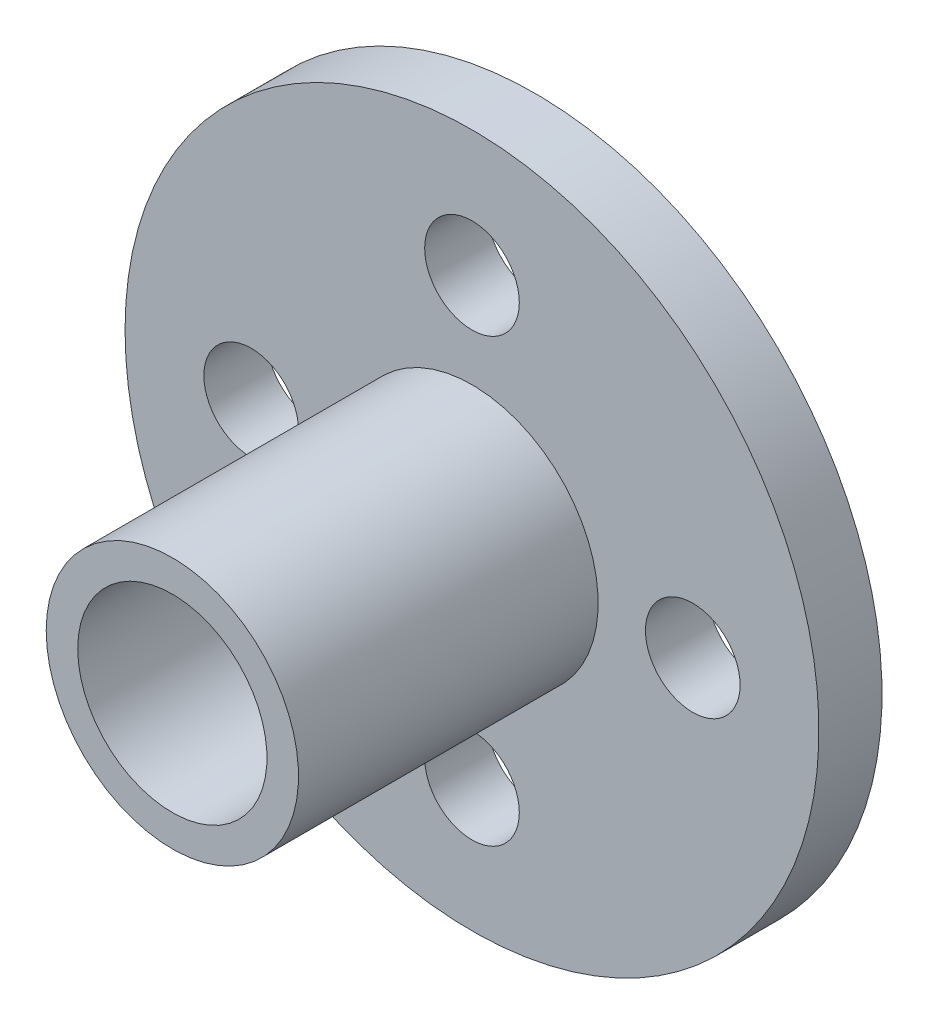
ISO-10303-21;
HEADER;
FILE_DESCRIPTION(('STEP AP214'),'2;1');
FILE_NAME('part.step','',(''),(''),'','','');
FILE_SCHEMA(('AUTOMOTIVE_DESIGN { 1 0 10303 214 1 1 1 1 }'));
ENDSEC;
DATA;
#1=APPLICATION_CONTEXT('core data for automotive mechanical design processes');
#2=APPLICATION_PROTOCOL_DEFINITION('international standard','automotive_design',2000,#1);
#3=PRODUCT_CONTEXT('',#1,'mechanical');
#4=PRODUCT('Part','Part','',(#3));
#5=PRODUCT_RELATED_PRODUCT_CATEGORY('part','',(#4));
#6=PRODUCT_DEFINITION_FORMATION('','',#4);
#7=PRODUCT_DEFINITION_CONTEXT('part definition',#1,'design');
#8=PRODUCT_DEFINITION('design','',#6,#7);
#9=PRODUCT_DEFINITION_SHAPE('','',#8);
#10=(LENGTH_UNIT() NAMED_UNIT(*) SI_UNIT(.MILLI.,.METRE.));
#11=(NAMED_UNIT(*) PLANE_ANGLE_UNIT() SI_UNIT($,.RADIAN.));
#12=(NAMED_UNIT(*) SI_UNIT($,.STERADIAN.) SOLID_ANGLE_UNIT());
#13=UNCERTAINTY_MEASURE_WITH_UNIT(LENGTH_MEASURE(1.E-05),#10,'distance_accuracy_value','');
#14=(GEOMETRIC_REPRESENTATION_CONTEXT(3) GLOBAL_UNCERTAINTY_ASSIGNED_CONTEXT((#13)) GLOBAL_UNIT_ASSIGNED_CONTEXT((#10,
#11,#12)) REPRESENTATION_CONTEXT('',''));
#15=CARTESIAN_POINT('',(0.,0.,0.));
#16=DIRECTION('',(0.,0.,1.));
#17=DIRECTION('',(1.,0.,0.));
#18=AXIS2_PLACEMENT_3D('',#15,#16,#17);
#19=CARTESIAN_POINT('',(2.99999999999999,0.,-3.3557561558247));
#20=DIRECTION('',(0.,0.,-1.));
#21=DIRECTION('',(-1.,0.,0.));
#22=AXIS2_PLACEMENT_3D('',#19,#20,#21);
#23=CYLINDRICAL_SURFACE('',#22,3.);
#24=CARTESIAN_POINT('',(3.,0.,0.));
#25=DIRECTION('',(0.,0.,-1.));
#26=DIRECTION('',(-1.,0.,0.));
#27=AXIS2_PLACEMENT_3D('',#24,#25,#26);
#28=CIRCLE('',#27,3.);
#29=CARTESIAN_POINT('',(0.,0.,0.));
#30=VERTEX_POINT('',#29);
#31=EDGE_CURVE('E10',#30,#30,#28,.T.);
#32=ORIENTED_EDGE('',*,*,#31,.T.);
#33=EDGE_LOOP('',(#32));
#34=FACE_BOUND('',#33,.T.);
#35=CARTESIAN_POINT('',(3.,0.,11.5));
#36=DIRECTION('',(0.,0.,-1.));
#37=DIRECTION('',(-1.,0.,0.));
#38=AXIS2_PLACEMENT_3D('',#35,#36,#37);
#39=CIRCLE('',#38,3.);
#40=CARTESIAN_POINT('',(0.,0.,11.5));
#41=VERTEX_POINT('',#40);
#42=EDGE_CURVE('E68',#41,#41,#39,.T.);
#43=ORIENTED_EDGE('',*,*,#42,.F.);
#44=EDGE_LOOP('',(#43));
#45=FACE_BOUND('',#44,.T.);
#46=ADVANCED_FACE('F41',(#34,#45),#23,.F.);
#47=CARTESIAN_POINT('',(0.,0.,0.));
#48=DIRECTION('',(0.,0.,-1.));
#49=DIRECTION('',(-1.,0.,0.));
#50=AXIS2_PLACEMENT_3D('',#47,#48,#49);
#51=PLANE('',#50);
#52=CARTESIAN_POINT('',(3.,7.,0.));
#53=DIRECTION('',(0.,0.,-1.));
#54=DIRECTION('',(-1.,0.,0.));
#55=AXIS2_PLACEMENT_3D('',#52,#53,#54);
#56=CIRCLE('',#55,1.5);
#57=CARTESIAN_POINT('',(1.5,7.,0.));
#58=VERTEX_POINT('',#57);
#59=EDGE_CURVE('E62',#58,#58,#56,.T.);
#60=ORIENTED_EDGE('',*,*,#59,.F.);
#61=EDGE_LOOP('',(#60));
#62=FACE_BOUND('',#61,.T.);
#63=CARTESIAN_POINT('',(-4.,0.,0.));
#64=DIRECTION('',(0.,0.,-1.));
#65=DIRECTION('',(-1.,0.,0.));
#66=AXIS2_PLACEMENT_3D('',#63,#64,#65);
#67=CIRCLE('',#66,1.5);
#68=CARTESIAN_POINT('',(-5.5,0.,0.));
#69=VERTEX_POINT('',#68);
#70=EDGE_CURVE('E122',#69,#69,#67,.T.);
#71=ORIENTED_EDGE('',*,*,#70,.F.);
#72=EDGE_LOOP('',(#71));
#73=FACE_BOUND('',#72,.T.);
#74=CARTESIAN_POINT('',(2.99999999999999,-7.,0.));
#75=DIRECTION('',(0.,0.,-1.));
#76=DIRECTION('',(-1.,0.,0.));
#77=AXIS2_PLACEMENT_3D('',#74,#75,#76);
#78=CIRCLE('',#77,1.5);
#79=CARTESIAN_POINT('',(1.49999999999999,-7.,0.));
#80=VERTEX_POINT('',#79);
#81=EDGE_CURVE('E121',#80,#80,#78,.T.);
#82=ORIENTED_EDGE('',*,*,#81,.F.);
#83=EDGE_LOOP('',(#82));
#84=FACE_BOUND('',#83,.T.);
#85=CARTESIAN_POINT('',(10.,0.,0.));
#86=DIRECTION('',(0.,0.,-1.));
#87=DIRECTION('',(-1.,0.,0.));
#88=AXIS2_PLACEMENT_3D('',#85,#86,#87);
#89=CIRCLE('',#88,1.5);
#90=CARTESIAN_POINT('',(8.5,0.,0.));
#91=VERTEX_POINT('',#90);
#92=EDGE_CURVE('E76',#91,#91,#89,.T.);
#93=ORIENTED_EDGE('',*,*,#92,.F.);
#94=EDGE_LOOP('',(#93));
#95=FACE_BOUND('',#94,.T.);
#96=CARTESIAN_POINT('',(3.,0.,0.));
#97=DIRECTION('',(0.,0.,-1.));
#98=DIRECTION('',(-1.,0.,0.));
#99=AXIS2_PLACEMENT_3D('',#96,#97,#98);
#100=CIRCLE('',#99,11.);
#101=CARTESIAN_POINT('',(-8.,0.,0.));
#102=VERTEX_POINT('',#101);
#103=EDGE_CURVE('E48',#102,#102,#100,.T.);
#104=ORIENTED_EDGE('',*,*,#103,.T.);
#105=EDGE_LOOP('',(#104));
#106=FACE_BOUND('',#105,.T.);
#107=ORIENTED_EDGE('',*,*,#31,.F.);
#108=EDGE_LOOP('',(#107));
#109=FACE_BOUND('',#108,.T.);
#110=ADVANCED_FACE('F102',(#62,#73,#84,#95,#106,#109),#51,.T.);
#111=CARTESIAN_POINT('',(2.99999999999999,0.,-3.3557561558247));
#112=DIRECTION('',(0.,0.,-1.));
#113=DIRECTION('',(-1.,0.,0.));
#114=AXIS2_PLACEMENT_3D('',#111,#112,#113);
#115=CYLINDRICAL_SURFACE('',#114,11.);
#116=CARTESIAN_POINT('',(3.,0.,2.));
#117=DIRECTION('',(0.,0.,-1.));
#118=DIRECTION('',(-1.,0.,0.));
#119=AXIS2_PLACEMENT_3D('',#116,#117,#118);
#120=CIRCLE('',#119,11.);
#121=CARTESIAN_POINT('',(-8.,0.,2.));
#122=VERTEX_POINT('',#121);
#123=EDGE_CURVE('E52',#122,#122,#120,.T.);
#124=ORIENTED_EDGE('',*,*,#123,.T.);
#125=EDGE_LOOP('',(#124));
#126=FACE_BOUND('',#125,.T.);
#127=ORIENTED_EDGE('',*,*,#103,.F.);
#128=EDGE_LOOP('',(#127));
#129=FACE_BOUND('',#128,.T.);
#130=ADVANCED_FACE('F87',(#126,#129),#115,.T.);
#131=CARTESIAN_POINT('',(-8.,0.,2.));
#132=DIRECTION('',(0.,0.,1.));
#133=DIRECTION('',(1.,0.,0.));
#134=AXIS2_PLACEMENT_3D('',#131,#132,#133);
#135=PLANE('',#134);
#136=CARTESIAN_POINT('',(3.,7.,2.));
#137=DIRECTION('',(0.,0.,1.));
#138=DIRECTION('',(1.,0.,0.));
#139=AXIS2_PLACEMENT_3D('',#136,#137,#138);
#140=CIRCLE('',#139,1.5);
#141=CARTESIAN_POINT('',(4.5,7.,2.));
#142=VERTEX_POINT('',#141);
#143=EDGE_CURVE('E42',#142,#142,#140,.T.);
#144=ORIENTED_EDGE('',*,*,#143,.F.);
#145=EDGE_LOOP('',(#144));
#146=FACE_BOUND('',#145,.T.);
#147=CARTESIAN_POINT('',(-4.,0.,2.));
#148=DIRECTION('',(0.,0.,1.));
#149=DIRECTION('',(1.,0.,0.));
#150=AXIS2_PLACEMENT_3D('',#147,#148,#149);
#151=CIRCLE('',#150,1.5);
#152=CARTESIAN_POINT('',(-2.5,0.,2.));
#153=VERTEX_POINT('',#152);
#154=EDGE_CURVE('E63',#153,#153,#151,.T.);
#155=ORIENTED_EDGE('',*,*,#154,.F.);
#156=EDGE_LOOP('',(#155));
#157=FACE_BOUND('',#156,.T.);
#158=CARTESIAN_POINT('',(2.99999999999999,-7.,2.));
#159=DIRECTION('',(0.,0.,1.));
#160=DIRECTION('',(1.,0.,0.));
#161=AXIS2_PLACEMENT_3D('',#158,#159,#160);
#162=CIRCLE('',#161,1.5);
#163=CARTESIAN_POINT('',(4.49999999999999,-7.,2.));
#164=VERTEX_POINT('',#163);
#165=EDGE_CURVE('E58',#164,#164,#162,.T.);
#166=ORIENTED_EDGE('',*,*,#165,.F.);
#167=EDGE_LOOP('',(#166));
#168=FACE_BOUND('',#167,.T.);
#169=CARTESIAN_POINT('',(10.,0.,2.));
#170=DIRECTION('',(0.,0.,1.));
#171=DIRECTION('',(1.,0.,0.));
#172=AXIS2_PLACEMENT_3D('',#169,#170,#171);
#173=CIRCLE('',#172,1.5);
#174=CARTESIAN_POINT('',(11.5,0.,2.));
#175=VERTEX_POINT('',#174);
#176=EDGE_CURVE('E60',#175,#175,#173,.T.);
#177=ORIENTED_EDGE('',*,*,#176,.F.);
#178=EDGE_LOOP('',(#177));
#179=FACE_BOUND('',#178,.T.);
#180=CARTESIAN_POINT('',(3.,0.,2.));
#181=DIRECTION('',(0.,0.,-1.));
#182=DIRECTION('',(-1.,0.,0.));
#183=AXIS2_PLACEMENT_3D('',#180,#181,#182);
#184=CIRCLE('',#183,4.);
#185=CARTESIAN_POINT('',(-1.,0.,2.));
#186=VERTEX_POINT('',#185);
#187=EDGE_CURVE('E80',#186,#186,#184,.T.);
#188=ORIENTED_EDGE('',*,*,#187,.T.);
#189=EDGE_LOOP('',(#188));
#190=FACE_BOUND('',#189,.T.);
#191=ORIENTED_EDGE('',*,*,#123,.F.);
#192=EDGE_LOOP('',(#191));
#193=FACE_BOUND('',#192,.T.);
#194=ADVANCED_FACE('F89',(#146,#157,#168,#179,#190,#193),#135,.T.);
#195=CARTESIAN_POINT('',(2.99999999999999,0.,-3.3557561558247));
#196=DIRECTION('',(0.,0.,-1.));
#197=DIRECTION('',(-1.,0.,0.));
#198=AXIS2_PLACEMENT_3D('',#195,#196,#197);
#199=CYLINDRICAL_SURFACE('',#198,4.);
#200=CARTESIAN_POINT('',(3.,0.,11.5));
#201=DIRECTION('',(0.,0.,-1.));
#202=DIRECTION('',(-1.,0.,0.));
#203=AXIS2_PLACEMENT_3D('',#200,#201,#202);
#204=CIRCLE('',#203,4.);
#205=CARTESIAN_POINT('',(-1.,0.,11.5));
#206=VERTEX_POINT('',#205);
#207=EDGE_CURVE('E75',#206,#206,#204,.T.);
#208=ORIENTED_EDGE('',*,*,#207,.T.);
#209=EDGE_LOOP('',(#208));
#210=FACE_BOUND('',#209,.T.);
#211=ORIENTED_EDGE('',*,*,#187,.F.);
#212=EDGE_LOOP('',(#211));
#213=FACE_BOUND('',#212,.T.);
#214=ADVANCED_FACE('F95',(#210,#213),#199,.T.);
#215=CARTESIAN_POINT('',(-1.,0.,11.5));
#216=DIRECTION('',(0.,0.,1.));
#217=DIRECTION('',(1.,0.,0.));
#218=AXIS2_PLACEMENT_3D('',#215,#216,#217);
#219=PLANE('',#218);
#220=ORIENTED_EDGE('',*,*,#42,.T.);
#221=EDGE_LOOP('',(#220));
#222=FACE_BOUND('',#221,.T.);
#223=ORIENTED_EDGE('',*,*,#207,.F.);
#224=EDGE_LOOP('',(#223));
#225=FACE_BOUND('',#224,.T.);
#226=ADVANCED_FACE('F99',(#222,#225),#219,.T.);
#227=CARTESIAN_POINT('',(10.,0.,10.));
#228=DIRECTION('',(0.,0.,-1.));
#229=DIRECTION('',(-1.,0.,0.));
#230=AXIS2_PLACEMENT_3D('',#227,#228,#229);
#231=CYLINDRICAL_SURFACE('',#230,1.5);
#232=ORIENTED_EDGE('',*,*,#176,.T.);
#233=EDGE_LOOP('',(#232));
#234=FACE_BOUND('',#233,.T.);
#235=ORIENTED_EDGE('',*,*,#92,.T.);
#236=EDGE_LOOP('',(#235));
#237=FACE_BOUND('',#236,.T.);
#238=ADVANCED_FACE('F146',(#234,#237),#231,.F.);
#239=CARTESIAN_POINT('',(3.,-7.,10.));
#240=DIRECTION('',(0.,0.,-1.));
#241=DIRECTION('',(-1.,0.,0.));
#242=AXIS2_PLACEMENT_3D('',#239,#240,#241);
#243=CYLINDRICAL_SURFACE('',#242,1.5);
#244=ORIENTED_EDGE('',*,*,#165,.T.);
#245=EDGE_LOOP('',(#244));
#246=FACE_BOUND('',#245,.T.);
#247=ORIENTED_EDGE('',*,*,#81,.T.);
#248=EDGE_LOOP('',(#247));
#249=FACE_BOUND('',#248,.T.);
#250=ADVANCED_FACE('F141',(#246,#249),#243,.F.);
#251=CARTESIAN_POINT('',(-4.,0.,10.));
#252=DIRECTION('',(0.,0.,-1.));
#253=DIRECTION('',(-1.,0.,0.));
#254=AXIS2_PLACEMENT_3D('',#251,#252,#253);
#255=CYLINDRICAL_SURFACE('',#254,1.5);
#256=ORIENTED_EDGE('',*,*,#154,.T.);
#257=EDGE_LOOP('',(#256));
#258=FACE_BOUND('',#257,.T.);
#259=ORIENTED_EDGE('',*,*,#70,.T.);
#260=EDGE_LOOP('',(#259));
#261=FACE_BOUND('',#260,.T.);
#262=ADVANCED_FACE('F138',(#258,#261),#255,.F.);
#263=CARTESIAN_POINT('',(3.,7.,10.));
#264=DIRECTION('',(0.,0.,-1.));
#265=DIRECTION('',(-1.,0.,0.));
#266=AXIS2_PLACEMENT_3D('',#263,#264,#265);
#267=CYLINDRICAL_SURFACE('',#266,1.5);
#268=ORIENTED_EDGE('',*,*,#143,.T.);
#269=EDGE_LOOP('',(#268));
#270=FACE_BOUND('',#269,.T.);
#271=ORIENTED_EDGE('',*,*,#59,.T.);
#272=EDGE_LOOP('',(#271));
#273=FACE_BOUND('',#272,.T.);
#274=ADVANCED_FACE('F137',(#270,#273),#267,.F.);
#275=CLOSED_SHELL('',(#46,#110,#130,#194,#214,#226,#238,#250,#262,#274));
#276=MANIFOLD_SOLID_BREP('B2',#275);
#277=ADVANCED_BREP_SHAPE_REPRESENTATION('',(#18,#276),#14);
#278=SHAPE_DEFINITION_REPRESENTATION(#9,#277);
ENDSEC;
END-ISO-10303-21;
